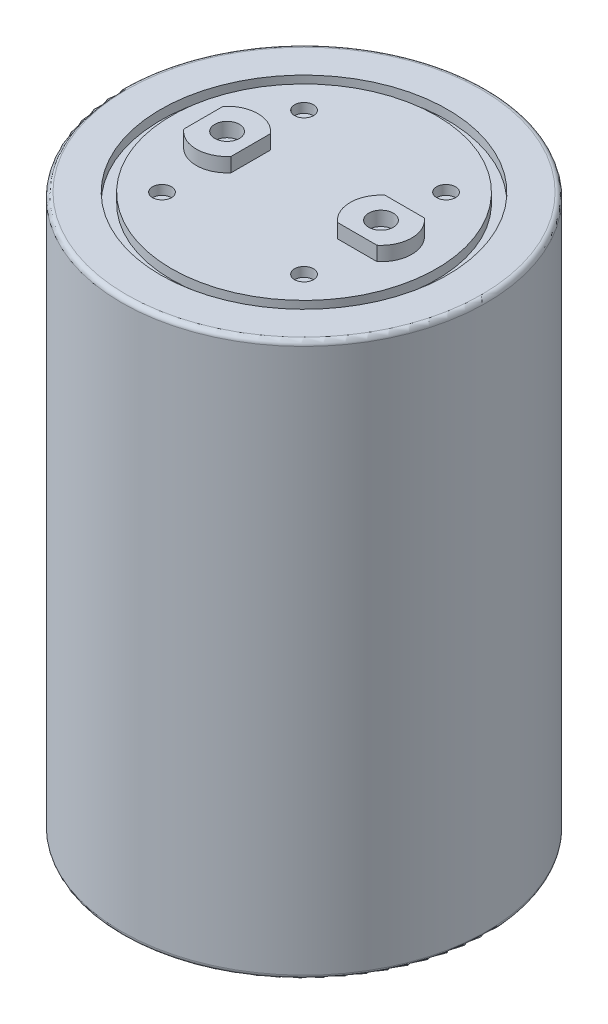
ISO-10303-21;
HEADER;
FILE_DESCRIPTION(('STEP AP214'),'2;1');
FILE_NAME('part.step','',(''),(''),'','','');
FILE_SCHEMA(('AUTOMOTIVE_DESIGN { 1 0 10303 214 1 1 1 1 }'));
ENDSEC;
DATA;
#1=APPLICATION_CONTEXT('core data for automotive mechanical design processes');
#2=APPLICATION_PROTOCOL_DEFINITION('international standard','automotive_design',2000,#1);
#3=PRODUCT_CONTEXT('',#1,'mechanical');
#4=PRODUCT('Part','Part','',(#3));
#5=PRODUCT_RELATED_PRODUCT_CATEGORY('part','',(#4));
#6=PRODUCT_DEFINITION_FORMATION('','',#4);
#7=PRODUCT_DEFINITION_CONTEXT('part definition',#1,'design');
#8=PRODUCT_DEFINITION('design','',#6,#7);
#9=PRODUCT_DEFINITION_SHAPE('','',#8);
#10=(LENGTH_UNIT() NAMED_UNIT(*) SI_UNIT(.MILLI.,.METRE.));
#11=(NAMED_UNIT(*) PLANE_ANGLE_UNIT() SI_UNIT($,.RADIAN.));
#12=(NAMED_UNIT(*) SI_UNIT($,.STERADIAN.) SOLID_ANGLE_UNIT());
#13=UNCERTAINTY_MEASURE_WITH_UNIT(LENGTH_MEASURE(1.E-05),#10,'distance_accuracy_value','');
#14=(GEOMETRIC_REPRESENTATION_CONTEXT(3) GLOBAL_UNCERTAINTY_ASSIGNED_CONTEXT((#13)) GLOBAL_UNIT_ASSIGNED_CONTEXT((#10,
#11,#12)) REPRESENTATION_CONTEXT('',''));
#15=CARTESIAN_POINT('',(0.,0.,0.));
#16=DIRECTION('',(0.,0.,1.));
#17=DIRECTION('',(1.,0.,0.));
#18=AXIS2_PLACEMENT_3D('',#15,#16,#17);
#19=CARTESIAN_POINT('',(1.1478244810946,60.4471649497469,37.8154701534106));
#20=DIRECTION('',(0.,1.,0.));
#21=DIRECTION('',(0.,0.,1.));
#22=AXIS2_PLACEMENT_3D('',#19,#20,#21);
#23=PLANE('',#22);
#24=CARTESIAN_POINT('',(16.1478244810946,60.4471649497469,22.8154701534106));
#25=DIRECTION('',(0.,1.,0.));
#26=DIRECTION('',(0.,0.,1.));
#27=AXIS2_PLACEMENT_3D('',#24,#25,#26);
#28=CIRCLE('',#27,2.);
#29=CARTESIAN_POINT('',(16.1478244810946,60.4471649497469,24.8154701534106));
#30=VERTEX_POINT('',#29);
#31=EDGE_CURVE('E69',#30,#30,#28,.T.);
#32=ORIENTED_EDGE('',*,*,#31,.F.);
#33=EDGE_LOOP('',(#32));
#34=FACE_BOUND('',#33,.T.);
#35=CARTESIAN_POINT('',(-13.8521755189054,60.4471649497469,22.8154701534106));
#36=DIRECTION('',(0.,1.,0.));
#37=DIRECTION('',(0.,0.,-1.));
#38=AXIS2_PLACEMENT_3D('',#35,#36,#37);
#39=CIRCLE('',#38,2.);
#40=CARTESIAN_POINT('',(-13.8521755189054,60.4471649497469,20.8154701534106));
#41=VERTEX_POINT('',#40);
#42=EDGE_CURVE('E58',#41,#41,#39,.T.);
#43=ORIENTED_EDGE('',*,*,#42,.F.);
#44=EDGE_LOOP('',(#43));
#45=FACE_BOUND('',#44,.T.);
#46=CARTESIAN_POINT('',(1.1478244810946,60.4471649497469,37.8154701534106));
#47=DIRECTION('',(0.,1.,0.));
#48=DIRECTION('',(0.,0.,1.));
#49=AXIS2_PLACEMENT_3D('',#46,#47,#48);
#50=CIRCLE('',#49,28.);
#51=CARTESIAN_POINT('',(1.1478244810946,60.4471649497469,65.8154701534106));
#52=VERTEX_POINT('',#51);
#53=EDGE_CURVE('E11',#52,#52,#50,.T.);
#54=ORIENTED_EDGE('',*,*,#53,.T.);
#55=EDGE_LOOP('',(#54));
#56=FACE_BOUND('',#55,.T.);
#57=CARTESIAN_POINT('',(16.1478244810946,60.4471649497469,52.8154701534106));
#58=DIRECTION('',(0.,1.,0.));
#59=DIRECTION('',(0.,0.,1.));
#60=AXIS2_PLACEMENT_3D('',#57,#58,#59);
#61=CIRCLE('',#60,2.);
#62=CARTESIAN_POINT('',(16.1478244810946,60.4471649497469,54.8154701534106));
#63=VERTEX_POINT('',#62);
#64=EDGE_CURVE('E63',#63,#63,#61,.T.);
#65=ORIENTED_EDGE('',*,*,#64,.F.);
#66=EDGE_LOOP('',(#65));
#67=FACE_BOUND('',#66,.T.);
#68=CARTESIAN_POINT('',(-13.8521755189054,60.4471649497469,52.8154701534106));
#69=DIRECTION('',(0.,1.,0.));
#70=DIRECTION('',(0.,0.,-1.));
#71=AXIS2_PLACEMENT_3D('',#68,#69,#70);
#72=CIRCLE('',#71,2.);
#73=CARTESIAN_POINT('',(-13.8521755189054,60.4471649497469,50.8154701534106));
#74=VERTEX_POINT('',#73);
#75=EDGE_CURVE('E75',#74,#74,#72,.T.);
#76=ORIENTED_EDGE('',*,*,#75,.F.);
#77=EDGE_LOOP('',(#76));
#78=FACE_BOUND('',#77,.T.);
#79=ADVANCED_FACE('F47',(#34,#45,#56,#67,#78),#23,.T.);
#80=CARTESIAN_POINT('',(1.1478244810946,58.4471649497469,37.8154701534106));
#81=DIRECTION('',(0.,1.,0.));
#82=DIRECTION('',(0.,0.,1.));
#83=AXIS2_PLACEMENT_3D('',#80,#81,#82);
#84=PLANE('',#83);
#85=CARTESIAN_POINT('',(1.1478244810946,58.4471649497469,37.8154701534106));
#86=DIRECTION('',(0.,1.,0.));
#87=DIRECTION('',(0.,0.,1.));
#88=AXIS2_PLACEMENT_3D('',#85,#86,#87);
#89=CIRCLE('',#88,28.);
#90=CARTESIAN_POINT('',(1.1478244810946,58.4471649497469,65.8154701534106));
#91=VERTEX_POINT('',#90);
#92=EDGE_CURVE('E51',#91,#91,#89,.T.);
#93=ORIENTED_EDGE('',*,*,#92,.F.);
#94=EDGE_LOOP('',(#93));
#95=FACE_BOUND('',#94,.T.);
#96=CARTESIAN_POINT('',(-13.8521755189054,58.4471649497469,22.8154701534106));
#97=DIRECTION('',(0.,1.,0.));
#98=DIRECTION('',(0.,0.,-1.));
#99=AXIS2_PLACEMENT_3D('',#96,#97,#98);
#100=CIRCLE('',#99,2.);
#101=CARTESIAN_POINT('',(-13.8521755189054,58.4471649497469,20.8154701534106));
#102=VERTEX_POINT('',#101);
#103=EDGE_CURVE('E60',#102,#102,#100,.T.);
#104=ORIENTED_EDGE('',*,*,#103,.T.);
#105=EDGE_LOOP('',(#104));
#106=FACE_BOUND('',#105,.T.);
#107=CARTESIAN_POINT('',(16.1478244810946,58.4471649497469,52.8154701534106));
#108=DIRECTION('',(0.,1.,0.));
#109=DIRECTION('',(0.,0.,1.));
#110=AXIS2_PLACEMENT_3D('',#107,#108,#109);
#111=CIRCLE('',#110,2.);
#112=CARTESIAN_POINT('',(16.1478244810946,58.4471649497469,54.8154701534106));
#113=VERTEX_POINT('',#112);
#114=EDGE_CURVE('E66',#113,#113,#111,.T.);
#115=ORIENTED_EDGE('',*,*,#114,.T.);
#116=EDGE_LOOP('',(#115));
#117=FACE_BOUND('',#116,.T.);
#118=CARTESIAN_POINT('',(16.1478244810946,58.4471649497469,22.8154701534106));
#119=DIRECTION('',(0.,1.,0.));
#120=DIRECTION('',(0.,0.,1.));
#121=AXIS2_PLACEMENT_3D('',#118,#119,#120);
#122=CIRCLE('',#121,2.);
#123=CARTESIAN_POINT('',(16.1478244810946,58.4471649497469,24.8154701534106));
#124=VERTEX_POINT('',#123);
#125=EDGE_CURVE('E72',#124,#124,#122,.T.);
#126=ORIENTED_EDGE('',*,*,#125,.T.);
#127=EDGE_LOOP('',(#126));
#128=FACE_BOUND('',#127,.T.);
#129=CARTESIAN_POINT('',(-13.8521755189054,58.4471649497469,52.8154701534106));
#130=DIRECTION('',(0.,1.,0.));
#131=DIRECTION('',(0.,0.,-1.));
#132=AXIS2_PLACEMENT_3D('',#129,#130,#131);
#133=CIRCLE('',#132,2.);
#134=CARTESIAN_POINT('',(-13.8521755189054,58.4471649497469,50.8154701534106));
#135=VERTEX_POINT('',#134);
#136=EDGE_CURVE('E78',#135,#135,#133,.T.);
#137=ORIENTED_EDGE('',*,*,#136,.T.);
#138=EDGE_LOOP('',(#137));
#139=FACE_BOUND('',#138,.T.);
#140=ADVANCED_FACE('F88',(#95,#106,#117,#128,#139),#84,.F.);
#141=CARTESIAN_POINT('',(1.1478244810946,60.4471649497469,37.8154701534106));
#142=DIRECTION('',(0.,-1.,0.));
#143=DIRECTION('',(0.,0.,-1.));
#144=AXIS2_PLACEMENT_3D('',#141,#142,#143);
#145=CYLINDRICAL_SURFACE('',#144,28.);
#146=ORIENTED_EDGE('',*,*,#53,.F.);
#147=EDGE_LOOP('',(#146));
#148=FACE_BOUND('',#147,.T.);
#149=ORIENTED_EDGE('',*,*,#92,.T.);
#150=EDGE_LOOP('',(#149));
#151=FACE_BOUND('',#150,.T.);
#152=ADVANCED_FACE('F49',(#148,#151),#145,.T.);
#153=CARTESIAN_POINT('',(-13.8521755189054,60.4471649497469,22.8154701534106));
#154=DIRECTION('',(0.,-1.,0.));
#155=DIRECTION('',(0.,0.,-1.));
#156=AXIS2_PLACEMENT_3D('',#153,#154,#155);
#157=CYLINDRICAL_SURFACE('',#156,2.);
#158=ORIENTED_EDGE('',*,*,#42,.T.);
#159=EDGE_LOOP('',(#158));
#160=FACE_BOUND('',#159,.T.);
#161=ORIENTED_EDGE('',*,*,#103,.F.);
#162=EDGE_LOOP('',(#161));
#163=FACE_BOUND('',#162,.T.);
#164=ADVANCED_FACE('F98',(#160,#163),#157,.F.);
#165=CARTESIAN_POINT('',(16.1478244810946,60.4471649497469,52.8154701534106));
#166=DIRECTION('',(0.,-1.,0.));
#167=DIRECTION('',(0.,0.,-1.));
#168=AXIS2_PLACEMENT_3D('',#165,#166,#167);
#169=CYLINDRICAL_SURFACE('',#168,2.);
#170=ORIENTED_EDGE('',*,*,#64,.T.);
#171=EDGE_LOOP('',(#170));
#172=FACE_BOUND('',#171,.T.);
#173=ORIENTED_EDGE('',*,*,#114,.F.);
#174=EDGE_LOOP('',(#173));
#175=FACE_BOUND('',#174,.T.);
#176=ADVANCED_FACE('F101',(#172,#175),#169,.F.);
#177=CARTESIAN_POINT('',(16.1478244810946,60.4471649497469,22.8154701534106));
#178=DIRECTION('',(0.,-1.,0.));
#179=DIRECTION('',(0.,0.,-1.));
#180=AXIS2_PLACEMENT_3D('',#177,#178,#179);
#181=CYLINDRICAL_SURFACE('',#180,2.);
#182=ORIENTED_EDGE('',*,*,#31,.T.);
#183=EDGE_LOOP('',(#182));
#184=FACE_BOUND('',#183,.T.);
#185=ORIENTED_EDGE('',*,*,#125,.F.);
#186=EDGE_LOOP('',(#185));
#187=FACE_BOUND('',#186,.T.);
#188=ADVANCED_FACE('F105',(#184,#187),#181,.F.);
#189=CARTESIAN_POINT('',(-13.8521755189054,60.4471649497469,52.8154701534106));
#190=DIRECTION('',(0.,-1.,0.));
#191=DIRECTION('',(0.,0.,-1.));
#192=AXIS2_PLACEMENT_3D('',#189,#190,#191);
#193=CYLINDRICAL_SURFACE('',#192,2.);
#194=ORIENTED_EDGE('',*,*,#75,.T.);
#195=EDGE_LOOP('',(#194));
#196=FACE_BOUND('',#195,.T.);
#197=ORIENTED_EDGE('',*,*,#136,.F.);
#198=EDGE_LOOP('',(#197));
#199=FACE_BOUND('',#198,.T.);
#200=ADVANCED_FACE('F84',(#196,#199),#193,.F.);
#201=CLOSED_SHELL('',(#79,#140,#152,#164,#176,#188,#200));
#202=MANIFOLD_SOLID_BREP('B2',#201);
#203=CARTESIAN_POINT('',(1.1478244810946,58.4471649497469,37.8154701534106));
#204=DIRECTION('',(0.,1.,0.));
#205=DIRECTION('',(0.,0.,1.));
#206=AXIS2_PLACEMENT_3D('',#203,#204,#205);
#207=PLANE('',#206);
#208=DIRECTION('',(0.,0.,1.));
#209=VECTOR('',#208,1.);
#210=CARTESIAN_POINT('',(-20.1021755189054,58.4471649497469,33.6621582219516));
#211=LINE('',#210,#209);
#212=CARTESIAN_POINT('',(-20.1021755189054,58.4471649497469,33.6621582219516));
#213=VERTEX_POINT('',#212);
#214=CARTESIAN_POINT('',(-20.1021755189054,58.4471649497469,41.9687820848696));
#215=VERTEX_POINT('',#214);
#216=EDGE_CURVE('E285',#213,#215,#211,.T.);
#217=ORIENTED_EDGE('',*,*,#216,.F.);
#218=CARTESIAN_POINT('',(-15.1021755189054,58.4471649497469,37.8154701534106));
#219=DIRECTION('',(0.,1.,0.));
#220=DIRECTION('',(0.,0.,1.));
#221=AXIS2_PLACEMENT_3D('',#218,#219,#220);
#222=CIRCLE('',#221,6.5);
#223=CARTESIAN_POINT('',(-10.1021755189054,58.4471649497469,33.6621582219516));
#224=VERTEX_POINT('',#223);
#225=EDGE_CURVE('E267',#224,#213,#222,.T.);
#226=ORIENTED_EDGE('',*,*,#225,.F.);
#227=DIRECTION('',(0.,0.,-1.));
#228=VECTOR('',#227,1.);
#229=CARTESIAN_POINT('',(-10.1021755189054,58.4471649497469,41.9687820848696));
#230=LINE('',#229,#228);
#231=CARTESIAN_POINT('',(-10.1021755189054,58.4471649497469,41.9687820848696));
#232=VERTEX_POINT('',#231);
#233=EDGE_CURVE('E276',#232,#224,#230,.T.);
#234=ORIENTED_EDGE('',*,*,#233,.F.);
#235=CARTESIAN_POINT('',(-15.1021755189054,58.4471649497469,37.8154701534106));
#236=DIRECTION('',(0.,1.,0.));
#237=DIRECTION('',(0.,0.,-1.));
#238=AXIS2_PLACEMENT_3D('',#235,#236,#237);
#239=CIRCLE('',#238,6.5);
#240=EDGE_CURVE('E287',#215,#232,#239,.T.);
#241=ORIENTED_EDGE('',*,*,#240,.F.);
#242=EDGE_LOOP('',(#217,#226,#234,#241));
#243=FACE_BOUND('',#242,.T.);
#244=DIRECTION('',(-1.,0.,0.));
#245=VECTOR('',#244,1.);
#246=CARTESIAN_POINT('',(13.2445125496356,58.4471649497469,32.8154701534106));
#247=LINE('',#246,#245);
#248=CARTESIAN_POINT('',(21.5511364125536,58.4471649497469,32.8154701534106));
#249=VERTEX_POINT('',#248);
#250=CARTESIAN_POINT('',(13.2445125496356,58.4471649497469,32.8154701534106));
#251=VERTEX_POINT('',#250);
#252=EDGE_CURVE('E552',#249,#251,#247,.T.);
#253=ORIENTED_EDGE('',*,*,#252,.F.);
#254=CARTESIAN_POINT('',(17.3978244810946,58.4471649497469,37.8154701534106));
#255=DIRECTION('',(0.,1.,0.));
#256=DIRECTION('',(0.,0.,-1.));
#257=AXIS2_PLACEMENT_3D('',#254,#255,#256);
#258=CIRCLE('',#257,6.5);
#259=CARTESIAN_POINT('',(21.5511364125536,58.4471649497469,42.8154701534106));
#260=VERTEX_POINT('',#259);
#261=EDGE_CURVE('E262',#260,#249,#258,.T.);
#262=ORIENTED_EDGE('',*,*,#261,.F.);
#263=DIRECTION('',(1.,0.,0.));
#264=VECTOR('',#263,1.);
#265=CARTESIAN_POINT('',(21.5511364125536,58.4471649497469,42.8154701534106));
#266=LINE('',#265,#264);
#267=CARTESIAN_POINT('',(13.2445125496356,58.4471649497469,42.8154701534106));
#268=VERTEX_POINT('',#267);
#269=EDGE_CURVE('E258',#268,#260,#266,.T.);
#270=ORIENTED_EDGE('',*,*,#269,.F.);
#271=CARTESIAN_POINT('',(17.3978244810946,58.4471649497469,37.8154701534106));
#272=DIRECTION('',(0.,1.,0.));
#273=DIRECTION('',(0.,0.,1.));
#274=AXIS2_PLACEMENT_3D('',#271,#272,#273);
#275=CIRCLE('',#274,6.50000000000001);
#276=EDGE_CURVE('E554',#251,#268,#275,.T.);
#277=ORIENTED_EDGE('',*,*,#276,.F.);
#278=EDGE_LOOP('',(#253,#262,#270,#277));
#279=FACE_BOUND('',#278,.T.);
#280=CARTESIAN_POINT('',(1.1478244810946,58.4471649497469,37.8154701534106));
#281=DIRECTION('',(0.,1.,0.));
#282=DIRECTION('',(0.,0.,1.));
#283=AXIS2_PLACEMENT_3D('',#280,#281,#282);
#284=CIRCLE('',#283,30.3);
#285=CARTESIAN_POINT('',(1.1478244810946,58.4471649497469,68.1154701534106));
#286=VERTEX_POINT('',#285);
#287=EDGE_CURVE('E304',#286,#286,#284,.F.);
#288=ORIENTED_EDGE('',*,*,#287,.F.);
#289=EDGE_LOOP('',(#288));
#290=FACE_BOUND('',#289,.T.);
#291=ADVANCED_FACE('F172',(#243,#279,#290),#207,.T.);
#292=CARTESIAN_POINT('',(-15.1021755189054,63.4471649497469,37.8154701534106));
#293=DIRECTION('',(0.,1.,0.));
#294=DIRECTION('',(0.,0.,1.));
#295=AXIS2_PLACEMENT_3D('',#292,#293,#294);
#296=PLANE('',#295);
#297=CARTESIAN_POINT('',(-15.1021755189054,63.4471649497469,37.8154701534106));
#298=DIRECTION('',(0.,1.,0.));
#299=DIRECTION('',(0.,0.,1.));
#300=AXIS2_PLACEMENT_3D('',#297,#298,#299);
#301=CIRCLE('',#300,6.5);
#302=CARTESIAN_POINT('',(-10.1021755189054,63.4471649497469,33.6621582219516));
#303=VERTEX_POINT('',#302);
#304=CARTESIAN_POINT('',(-20.1021755189054,63.4471649497469,33.6621582219516));
#305=VERTEX_POINT('',#304);
#306=EDGE_CURVE('E272',#303,#305,#301,.T.);
#307=ORIENTED_EDGE('',*,*,#306,.T.);
#308=DIRECTION('',(0.,0.,1.));
#309=VECTOR('',#308,1.);
#310=CARTESIAN_POINT('',(-20.1021755189054,63.4471649497469,33.6621582219516));
#311=LINE('',#310,#309);
#312=CARTESIAN_POINT('',(-20.1021755189054,63.4471649497469,41.9687820848696));
#313=VERTEX_POINT('',#312);
#314=EDGE_CURVE('E275',#305,#313,#311,.T.);
#315=ORIENTED_EDGE('',*,*,#314,.T.);
#316=CARTESIAN_POINT('',(-15.1021755189054,63.4471649497469,37.8154701534106));
#317=DIRECTION('',(0.,1.,0.));
#318=DIRECTION('',(0.,0.,-1.));
#319=AXIS2_PLACEMENT_3D('',#316,#317,#318);
#320=CIRCLE('',#319,6.5);
#321=CARTESIAN_POINT('',(-10.1021755189054,63.4471649497469,41.9687820848696));
#322=VERTEX_POINT('',#321);
#323=EDGE_CURVE('E278',#313,#322,#320,.T.);
#324=ORIENTED_EDGE('',*,*,#323,.T.);
#325=DIRECTION('',(0.,0.,-1.));
#326=VECTOR('',#325,1.);
#327=CARTESIAN_POINT('',(-10.1021755189054,63.4471649497469,41.9687820848696));
#328=LINE('',#327,#326);
#329=EDGE_CURVE('E280',#322,#303,#328,.T.);
#330=ORIENTED_EDGE('',*,*,#329,.T.);
#331=EDGE_LOOP('',(#307,#315,#324,#330));
#332=FACE_BOUND('',#331,.T.);
#333=CARTESIAN_POINT('',(-15.1021755189054,63.4471649497469,37.8154701534106));
#334=DIRECTION('',(0.,1.,0.));
#335=DIRECTION('',(0.,0.,1.));
#336=AXIS2_PLACEMENT_3D('',#333,#334,#335);
#337=CIRCLE('',#336,2.6);
#338=CARTESIAN_POINT('',(-15.1021755189054,63.4471649497469,40.4154701534106));
#339=VERTEX_POINT('',#338);
#340=EDGE_CURVE('E264',#339,#339,#337,.T.);
#341=ORIENTED_EDGE('',*,*,#340,.F.);
#342=EDGE_LOOP('',(#341));
#343=FACE_BOUND('',#342,.T.);
#344=ADVANCED_FACE('F336',(#332,#343),#296,.T.);
#345=CARTESIAN_POINT('',(-15.1021755189054,63.4471649497469,37.8154701534106));
#346=DIRECTION('',(0.,-1.,0.));
#347=DIRECTION('',(0.,0.,-1.));
#348=AXIS2_PLACEMENT_3D('',#345,#346,#347);
#349=CYLINDRICAL_SURFACE('',#348,6.5);
#350=ORIENTED_EDGE('',*,*,#225,.T.);
#351=DIRECTION('',(0.,-1.,0.));
#352=VECTOR('',#351,1.);
#353=CARTESIAN_POINT('',(-20.1021755189054,63.4471649497469,33.6621582219516));
#354=LINE('',#353,#352);
#355=EDGE_CURVE('E296',#305,#213,#354,.T.);
#356=ORIENTED_EDGE('',*,*,#355,.F.);
#357=ORIENTED_EDGE('',*,*,#306,.F.);
#358=DIRECTION('',(0.,-1.,0.));
#359=VECTOR('',#358,1.);
#360=CARTESIAN_POINT('',(-10.1021755189054,63.4471649497469,33.6621582219516));
#361=LINE('',#360,#359);
#362=EDGE_CURVE('E282',#303,#224,#361,.T.);
#363=ORIENTED_EDGE('',*,*,#362,.T.);
#364=EDGE_LOOP('',(#350,#356,#357,#363));
#365=FACE_BOUND('',#364,.T.);
#366=ADVANCED_FACE('F344',(#365),#349,.T.);
#367=CARTESIAN_POINT('',(-20.1021755189054,63.4471649497469,33.6621582219516));
#368=DIRECTION('',(1.,0.,0.));
#369=DIRECTION('',(0.,0.,-1.));
#370=AXIS2_PLACEMENT_3D('',#367,#368,#369);
#371=PLANE('',#370);
#372=ORIENTED_EDGE('',*,*,#216,.T.);
#373=DIRECTION('',(0.,-1.,0.));
#374=VECTOR('',#373,1.);
#375=CARTESIAN_POINT('',(-20.1021755189054,63.4471649497469,41.9687820848696));
#376=LINE('',#375,#374);
#377=EDGE_CURVE('E293',#313,#215,#376,.T.);
#378=ORIENTED_EDGE('',*,*,#377,.F.);
#379=ORIENTED_EDGE('',*,*,#314,.F.);
#380=ORIENTED_EDGE('',*,*,#355,.T.);
#381=EDGE_LOOP('',(#372,#378,#379,#380));
#382=FACE_BOUND('',#381,.T.);
#383=ADVANCED_FACE('F377',(#382),#371,.F.);
#384=CARTESIAN_POINT('',(-15.1021755189054,63.4471649497469,37.8154701534106));
#385=DIRECTION('',(0.,-1.,0.));
#386=DIRECTION('',(0.,0.,-1.));
#387=AXIS2_PLACEMENT_3D('',#384,#385,#386);
#388=CYLINDRICAL_SURFACE('',#387,6.5);
#389=ORIENTED_EDGE('',*,*,#240,.T.);
#390=DIRECTION('',(0.,-1.,0.));
#391=VECTOR('',#390,1.);
#392=CARTESIAN_POINT('',(-10.1021755189054,63.4471649497469,41.9687820848696));
#393=LINE('',#392,#391);
#394=EDGE_CURVE('E195',#322,#232,#393,.T.);
#395=ORIENTED_EDGE('',*,*,#394,.F.);
#396=ORIENTED_EDGE('',*,*,#323,.F.);
#397=ORIENTED_EDGE('',*,*,#377,.T.);
#398=EDGE_LOOP('',(#389,#395,#396,#397));
#399=FACE_BOUND('',#398,.T.);
#400=ADVANCED_FACE('F370',(#399),#388,.T.);
#401=CARTESIAN_POINT('',(-10.1021755189054,63.4471649497469,41.9687820848696));
#402=DIRECTION('',(-1.,0.,0.));
#403=DIRECTION('',(0.,0.,1.));
#404=AXIS2_PLACEMENT_3D('',#401,#402,#403);
#405=PLANE('',#404);
#406=ORIENTED_EDGE('',*,*,#233,.T.);
#407=ORIENTED_EDGE('',*,*,#362,.F.);
#408=ORIENTED_EDGE('',*,*,#329,.F.);
#409=ORIENTED_EDGE('',*,*,#394,.T.);
#410=EDGE_LOOP('',(#406,#407,#408,#409));
#411=FACE_BOUND('',#410,.T.);
#412=ADVANCED_FACE('F362',(#411),#405,.F.);
#413=CARTESIAN_POINT('',(-15.1021755189054,63.4471649497469,37.8154701534106));
#414=DIRECTION('',(0.,-1.,0.));
#415=DIRECTION('',(0.,0.,-1.));
#416=AXIS2_PLACEMENT_3D('',#413,#414,#415);
#417=CYLINDRICAL_SURFACE('',#416,2.6);
#418=ORIENTED_EDGE('',*,*,#340,.T.);
#419=EDGE_LOOP('',(#418));
#420=FACE_BOUND('',#419,.T.);
#421=CARTESIAN_POINT('',(-15.1021755189054,58.4471649497469,37.8154701534106));
#422=DIRECTION('',(0.,1.,0.));
#423=DIRECTION('',(0.,0.,1.));
#424=AXIS2_PLACEMENT_3D('',#421,#422,#423);
#425=CIRCLE('',#424,2.6);
#426=CARTESIAN_POINT('',(-15.1021755189054,58.4471649497469,40.4154701534106));
#427=VERTEX_POINT('',#426);
#428=EDGE_CURVE('E298',#427,#427,#425,.F.);
#429=ORIENTED_EDGE('',*,*,#428,.T.);
#430=EDGE_LOOP('',(#429));
#431=FACE_BOUND('',#430,.T.);
#432=ADVANCED_FACE('F355',(#420,#431),#417,.F.);
#433=ORIENTED_EDGE('',*,*,#428,.F.);
#434=EDGE_LOOP('',(#433));
#435=FACE_BOUND('',#434,.T.);
#436=ADVANCED_FACE('F340',(#435),#207,.T.);
#437=CARTESIAN_POINT('',(17.3978244810946,63.4471649497469,37.8154701534106));
#438=DIRECTION('',(0.,-1.,0.));
#439=DIRECTION('',(0.,0.,-1.));
#440=AXIS2_PLACEMENT_3D('',#437,#438,#439);
#441=PLANE('',#440);
#442=CARTESIAN_POINT('',(17.3978244810946,63.4471649497469,37.8154701534106));
#443=DIRECTION('',(0.,1.,0.));
#444=DIRECTION('',(0.,0.,-1.));
#445=AXIS2_PLACEMENT_3D('',#442,#443,#444);
#446=CIRCLE('',#445,6.5);
#447=CARTESIAN_POINT('',(21.5511364125536,63.4471649497469,42.8154701534106));
#448=VERTEX_POINT('',#447);
#449=CARTESIAN_POINT('',(21.5511364125536,63.4471649497469,32.8154701534106));
#450=VERTEX_POINT('',#449);
#451=EDGE_CURVE('E249',#448,#450,#446,.T.);
#452=ORIENTED_EDGE('',*,*,#451,.T.);
#453=DIRECTION('',(-1.,0.,0.));
#454=VECTOR('',#453,1.);
#455=CARTESIAN_POINT('',(13.2445125496356,63.4471649497469,32.8154701534106));
#456=LINE('',#455,#454);
#457=CARTESIAN_POINT('',(13.2445125496356,63.4471649497469,32.8154701534106));
#458=VERTEX_POINT('',#457);
#459=EDGE_CURVE('E238',#450,#458,#456,.T.);
#460=ORIENTED_EDGE('',*,*,#459,.T.);
#461=CARTESIAN_POINT('',(17.3978244810946,63.4471649497469,37.8154701534106));
#462=DIRECTION('',(0.,1.,0.));
#463=DIRECTION('',(0.,0.,1.));
#464=AXIS2_PLACEMENT_3D('',#461,#462,#463);
#465=CIRCLE('',#464,6.50000000000001);
#466=CARTESIAN_POINT('',(13.2445125496356,63.4471649497469,42.8154701534106));
#467=VERTEX_POINT('',#466);
#468=EDGE_CURVE('E248',#458,#467,#465,.T.);
#469=ORIENTED_EDGE('',*,*,#468,.T.);
#470=DIRECTION('',(1.,0.,0.));
#471=VECTOR('',#470,1.);
#472=CARTESIAN_POINT('',(21.5511364125536,63.4471649497469,42.8154701534106));
#473=LINE('',#472,#471);
#474=EDGE_CURVE('E254',#467,#448,#473,.T.);
#475=ORIENTED_EDGE('',*,*,#474,.T.);
#476=EDGE_LOOP('',(#452,#460,#469,#475));
#477=FACE_BOUND('',#476,.T.);
#478=CARTESIAN_POINT('',(17.3978244810946,63.4471649497469,37.8154701534106));
#479=DIRECTION('',(0.,1.,0.));
#480=DIRECTION('',(0.,0.,1.));
#481=AXIS2_PLACEMENT_3D('',#478,#479,#480);
#482=CIRCLE('',#481,2.6);
#483=CARTESIAN_POINT('',(17.3978244810946,63.4471649497469,40.4154701534106));
#484=VERTEX_POINT('',#483);
#485=EDGE_CURVE('E543',#484,#484,#482,.T.);
#486=ORIENTED_EDGE('',*,*,#485,.F.);
#487=EDGE_LOOP('',(#486));
#488=FACE_BOUND('',#487,.T.);
#489=ADVANCED_FACE('F252',(#477,#488),#441,.F.);
#490=CARTESIAN_POINT('',(17.3978244810946,63.4471649497469,37.8154701534106));
#491=DIRECTION('',(0.,-1.,0.));
#492=DIRECTION('',(0.,0.,-1.));
#493=AXIS2_PLACEMENT_3D('',#490,#491,#492);
#494=CYLINDRICAL_SURFACE('',#493,6.5);
#495=ORIENTED_EDGE('',*,*,#261,.T.);
#496=DIRECTION('',(0.,-1.,0.));
#497=VECTOR('',#496,1.);
#498=CARTESIAN_POINT('',(21.5511364125536,63.4471649497469,32.8154701534106));
#499=LINE('',#498,#497);
#500=EDGE_CURVE('E242',#450,#249,#499,.T.);
#501=ORIENTED_EDGE('',*,*,#500,.F.);
#502=ORIENTED_EDGE('',*,*,#451,.F.);
#503=DIRECTION('',(0.,-1.,0.));
#504=VECTOR('',#503,1.);
#505=CARTESIAN_POINT('',(21.5511364125536,63.4471649497469,42.8154701534106));
#506=LINE('',#505,#504);
#507=EDGE_CURVE('E550',#448,#260,#506,.T.);
#508=ORIENTED_EDGE('',*,*,#507,.T.);
#509=EDGE_LOOP('',(#495,#501,#502,#508));
#510=FACE_BOUND('',#509,.T.);
#511=ADVANCED_FACE('F260',(#510),#494,.T.);
#512=CARTESIAN_POINT('',(13.2445125496356,63.4471649497469,32.8154701534106));
#513=DIRECTION('',(0.,0.,1.));
#514=DIRECTION('',(1.,0.,0.));
#515=AXIS2_PLACEMENT_3D('',#512,#513,#514);
#516=PLANE('',#515);
#517=ORIENTED_EDGE('',*,*,#252,.T.);
#518=DIRECTION('',(0.,-1.,0.));
#519=VECTOR('',#518,1.);
#520=CARTESIAN_POINT('',(13.2445125496356,63.4471649497469,32.8154701534106));
#521=LINE('',#520,#519);
#522=EDGE_CURVE('E245',#458,#251,#521,.T.);
#523=ORIENTED_EDGE('',*,*,#522,.F.);
#524=ORIENTED_EDGE('',*,*,#459,.F.);
#525=ORIENTED_EDGE('',*,*,#500,.T.);
#526=EDGE_LOOP('',(#517,#523,#524,#525));
#527=FACE_BOUND('',#526,.T.);
#528=ADVANCED_FACE('F240',(#527),#516,.F.);
#529=CARTESIAN_POINT('',(17.3978244810946,63.4471649497469,37.8154701534106));
#530=DIRECTION('',(0.,-1.,0.));
#531=DIRECTION('',(0.,0.,-1.));
#532=AXIS2_PLACEMENT_3D('',#529,#530,#531);
#533=CYLINDRICAL_SURFACE('',#532,6.50000000000001);
#534=ORIENTED_EDGE('',*,*,#276,.T.);
#535=DIRECTION('',(0.,-1.,0.));
#536=VECTOR('',#535,1.);
#537=CARTESIAN_POINT('',(13.2445125496356,63.4471649497469,42.8154701534106));
#538=LINE('',#537,#536);
#539=EDGE_CURVE('E187',#467,#268,#538,.T.);
#540=ORIENTED_EDGE('',*,*,#539,.F.);
#541=ORIENTED_EDGE('',*,*,#468,.F.);
#542=ORIENTED_EDGE('',*,*,#522,.T.);
#543=EDGE_LOOP('',(#534,#540,#541,#542));
#544=FACE_BOUND('',#543,.T.);
#545=ADVANCED_FACE('F439',(#544),#533,.T.);
#546=CARTESIAN_POINT('',(21.5511364125536,63.4471649497469,42.8154701534106));
#547=DIRECTION('',(0.,0.,-1.));
#548=DIRECTION('',(-1.,0.,0.));
#549=AXIS2_PLACEMENT_3D('',#546,#547,#548);
#550=PLANE('',#549);
#551=ORIENTED_EDGE('',*,*,#269,.T.);
#552=ORIENTED_EDGE('',*,*,#507,.F.);
#553=ORIENTED_EDGE('',*,*,#474,.F.);
#554=ORIENTED_EDGE('',*,*,#539,.T.);
#555=EDGE_LOOP('',(#551,#552,#553,#554));
#556=FACE_BOUND('',#555,.T.);
#557=ADVANCED_FACE('F447',(#556),#550,.F.);
#558=CARTESIAN_POINT('',(17.3978244810946,63.4471649497469,37.8154701534106));
#559=DIRECTION('',(0.,-1.,0.));
#560=DIRECTION('',(0.,0.,-1.));
#561=AXIS2_PLACEMENT_3D('',#558,#559,#560);
#562=CYLINDRICAL_SURFACE('',#561,2.6);
#563=ORIENTED_EDGE('',*,*,#485,.T.);
#564=EDGE_LOOP('',(#563));
#565=FACE_BOUND('',#564,.T.);
#566=CARTESIAN_POINT('',(17.3978244810946,58.4471649497469,37.8154701534106));
#567=DIRECTION('',(0.,1.,0.));
#568=DIRECTION('',(0.,0.,1.));
#569=AXIS2_PLACEMENT_3D('',#566,#567,#568);
#570=CIRCLE('',#569,2.6);
#571=CARTESIAN_POINT('',(17.3978244810946,58.4471649497469,40.4154701534106));
#572=VERTEX_POINT('',#571);
#573=EDGE_CURVE('E301',#572,#572,#570,.F.);
#574=ORIENTED_EDGE('',*,*,#573,.T.);
#575=EDGE_LOOP('',(#574));
#576=FACE_BOUND('',#575,.T.);
#577=ADVANCED_FACE('F352',(#565,#576),#562,.F.);
#578=ORIENTED_EDGE('',*,*,#573,.F.);
#579=EDGE_LOOP('',(#578));
#580=FACE_BOUND('',#579,.T.);
#581=ADVANCED_FACE('F339',(#580),#207,.T.);
#582=CARTESIAN_POINT('',(1.1478244810946,60.4471649497469,37.8154701534106));
#583=DIRECTION('',(0.,1.,0.));
#584=DIRECTION('',(0.,0.,1.));
#585=AXIS2_PLACEMENT_3D('',#582,#583,#584);
#586=PLANE('',#585);
#587=CARTESIAN_POINT('',(1.1478244810946,60.4471649497469,37.8154701534106));
#588=DIRECTION('',(0.,1.,0.));
#589=DIRECTION('',(0.,0.,1.));
#590=AXIS2_PLACEMENT_3D('',#587,#588,#589);
#591=CIRCLE('',#590,37.5);
#592=CARTESIAN_POINT('',(1.1478244810946,60.4471649497469,75.3154701534106));
#593=VERTEX_POINT('',#592);
#594=EDGE_CURVE('E180',#593,#593,#591,.T.);
#595=ORIENTED_EDGE('',*,*,#594,.T.);
#596=EDGE_LOOP('',(#595));
#597=FACE_BOUND('',#596,.T.);
#598=CARTESIAN_POINT('',(1.1478244810946,60.4471649497469,37.8154701534106));
#599=DIRECTION('',(0.,1.,0.));
#600=DIRECTION('',(0.,0.,1.));
#601=AXIS2_PLACEMENT_3D('',#598,#599,#600);
#602=CIRCLE('',#601,30.3);
#603=CARTESIAN_POINT('',(1.1478244810946,60.4471649497469,68.1154701534106));
#604=VERTEX_POINT('',#603);
#605=EDGE_CURVE('E540',#604,#604,#602,.T.);
#606=ORIENTED_EDGE('',*,*,#605,.F.);
#607=EDGE_LOOP('',(#606));
#608=FACE_BOUND('',#607,.T.);
#609=ADVANCED_FACE('F318',(#597,#608),#586,.T.);
#610=CARTESIAN_POINT('',(1.1478244810946,60.4471649497469,37.8154701534106));
#611=DIRECTION('',(0.,-1.,0.));
#612=DIRECTION('',(0.,0.,-1.));
#613=AXIS2_PLACEMENT_3D('',#610,#611,#612);
#614=CYLINDRICAL_SURFACE('',#613,30.3);
#615=ORIENTED_EDGE('',*,*,#605,.T.);
#616=EDGE_LOOP('',(#615));
#617=FACE_BOUND('',#616,.T.);
#618=ORIENTED_EDGE('',*,*,#287,.T.);
#619=EDGE_LOOP('',(#618));
#620=FACE_BOUND('',#619,.T.);
#621=ADVANCED_FACE('F480',(#617,#620),#614,.F.);
#622=CARTESIAN_POINT('',(1.1478244810946,-56.5528350502531,37.8154701534106));
#623=DIRECTION('',(0.,1.,0.));
#624=DIRECTION('',(0.,0.,1.));
#625=AXIS2_PLACEMENT_3D('',#622,#623,#624);
#626=PLANE('',#625);
#627=CARTESIAN_POINT('',(1.1478244810946,-56.5528350502531,37.8154701534106));
#628=DIRECTION('',(0.,1.,0.));
#629=DIRECTION('',(0.,0.,1.));
#630=AXIS2_PLACEMENT_3D('',#627,#628,#629);
#631=CIRCLE('',#630,6.);
#632=CARTESIAN_POINT('',(1.1478244810946,-56.5528350502531,43.8154701534106));
#633=VERTEX_POINT('',#632);
#634=EDGE_CURVE('E45',#633,#633,#631,.F.);
#635=ORIENTED_EDGE('',*,*,#634,.F.);
#636=EDGE_LOOP('',(#635));
#637=FACE_BOUND('',#636,.T.);
#638=CARTESIAN_POINT('',(1.1478244810946,-56.5528350502531,37.8154701534106));
#639=DIRECTION('',(0.,1.,0.));
#640=DIRECTION('',(0.,0.,1.));
#641=AXIS2_PLACEMENT_3D('',#638,#639,#640);
#642=CIRCLE('',#641,37.5);
#643=CARTESIAN_POINT('',(1.1478244810946,-56.5528350502531,75.3154701534106));
#644=VERTEX_POINT('',#643);
#645=EDGE_CURVE('E313',#644,#644,#642,.F.);
#646=ORIENTED_EDGE('',*,*,#645,.T.);
#647=EDGE_LOOP('',(#646));
#648=FACE_BOUND('',#647,.T.);
#649=ADVANCED_FACE('F489',(#637,#648),#626,.F.);
#650=CARTESIAN_POINT('',(1.1478244810946,58.4471649497469,37.8154701534106));
#651=DIRECTION('',(0.,-1.,0.));
#652=DIRECTION('',(0.,0.,-1.));
#653=AXIS2_PLACEMENT_3D('',#650,#651,#652);
#654=CYLINDRICAL_SURFACE('',#653,38.5);
#655=CARTESIAN_POINT('',(1.1478244810946,-55.5528350502531,37.8154701534106));
#656=DIRECTION('',(0.,1.,0.));
#657=DIRECTION('',(0.,0.,1.));
#658=AXIS2_PLACEMENT_3D('',#655,#656,#657);
#659=CIRCLE('',#658,38.5);
#660=CARTESIAN_POINT('',(1.1478244810946,-55.5528350502531,76.3154701534106));
#661=VERTEX_POINT('',#660);
#662=EDGE_CURVE('E310',#661,#661,#659,.T.);
#663=ORIENTED_EDGE('',*,*,#662,.T.);
#664=EDGE_LOOP('',(#663));
#665=FACE_BOUND('',#664,.T.);
#666=CARTESIAN_POINT('',(1.1478244810946,59.4471649497469,37.8154701534106));
#667=DIRECTION('',(0.,1.,0.));
#668=DIRECTION('',(0.,0.,1.));
#669=AXIS2_PLACEMENT_3D('',#666,#667,#668);
#670=CIRCLE('',#669,38.5);
#671=CARTESIAN_POINT('',(1.1478244810946,59.4471649497469,76.3154701534106));
#672=VERTEX_POINT('',#671);
#673=EDGE_CURVE('E307',#672,#672,#670,.F.);
#674=ORIENTED_EDGE('',*,*,#673,.T.);
#675=EDGE_LOOP('',(#674));
#676=FACE_BOUND('',#675,.T.);
#677=ADVANCED_FACE('F332',(#665,#676),#654,.T.);
#678=CARTESIAN_POINT('',(1.1478244810946,-55.5528350502531,37.8154701534106));
#679=DIRECTION('',(0.,1.,0.));
#680=DIRECTION('',(0.,0.,1.));
#681=AXIS2_PLACEMENT_3D('',#678,#679,#680);
#682=TOROIDAL_SURFACE('',#681,37.5,1.);
#683=ORIENTED_EDGE('',*,*,#645,.F.);
#684=EDGE_LOOP('',(#683));
#685=FACE_BOUND('',#684,.T.);
#686=ORIENTED_EDGE('',*,*,#662,.F.);
#687=EDGE_LOOP('',(#686));
#688=FACE_BOUND('',#687,.T.);
#689=ADVANCED_FACE('F323',(#685,#688),#682,.T.);
#690=CARTESIAN_POINT('',(1.1478244810946,59.4471649497469,37.8154701534106));
#691=DIRECTION('',(0.,1.,0.));
#692=DIRECTION('',(0.,0.,1.));
#693=AXIS2_PLACEMENT_3D('',#690,#691,#692);
#694=TOROIDAL_SURFACE('',#693,37.5,1.);
#695=ORIENTED_EDGE('',*,*,#673,.F.);
#696=EDGE_LOOP('',(#695));
#697=FACE_BOUND('',#696,.T.);
#698=ORIENTED_EDGE('',*,*,#594,.F.);
#699=EDGE_LOOP('',(#698));
#700=FACE_BOUND('',#699,.T.);
#701=ADVANCED_FACE('F174',(#697,#700),#694,.T.);
#702=CARTESIAN_POINT('',(1.1478244810946,-72.5528350502531,37.8154701534106));
#703=DIRECTION('',(0.,1.,0.));
#704=DIRECTION('',(0.,0.,1.));
#705=AXIS2_PLACEMENT_3D('',#702,#703,#704);
#706=CYLINDRICAL_SURFACE('',#705,6.);
#707=CARTESIAN_POINT('',(1.1478244810946,-72.5528350502531,37.8154701534106));
#708=DIRECTION('',(0.,-1.,0.));
#709=DIRECTION('',(0.,0.,-1.));
#710=AXIS2_PLACEMENT_3D('',#707,#708,#709);
#711=CIRCLE('',#710,6.);
#712=CARTESIAN_POINT('',(1.1478244810946,-72.5528350502531,31.8154701534106));
#713=VERTEX_POINT('',#712);
#714=EDGE_CURVE('E539',#713,#713,#711,.T.);
#715=ORIENTED_EDGE('',*,*,#714,.F.);
#716=EDGE_LOOP('',(#715));
#717=FACE_BOUND('',#716,.T.);
#718=ORIENTED_EDGE('',*,*,#634,.T.);
#719=EDGE_LOOP('',(#718));
#720=FACE_BOUND('',#719,.T.);
#721=ADVANCED_FACE('F322',(#717,#720),#706,.T.);
#722=CARTESIAN_POINT('',(1.1478244810946,-72.5528350502531,37.8154701534106));
#723=DIRECTION('',(0.,-1.,0.));
#724=DIRECTION('',(0.,0.,-1.));
#725=AXIS2_PLACEMENT_3D('',#722,#723,#724);
#726=PLANE('',#725);
#727=ORIENTED_EDGE('',*,*,#714,.T.);
#728=EDGE_LOOP('',(#727));
#729=FACE_BOUND('',#728,.T.);
#730=ADVANCED_FACE('F329',(#729),#726,.T.);
#731=CLOSED_SHELL('',(#291,#344,#366,#383,#400,#412,#432,#436,#489,#511,#528,#545,#557,#577,
#581,#609,#621,#649,#677,#689,#701,#721,#730));
#732=MANIFOLD_SOLID_BREP('B6_NOT_SHOWN',#731);
#733=ADVANCED_BREP_SHAPE_REPRESENTATION('',(#18,#202,#732),#14);
#734=SHAPE_DEFINITION_REPRESENTATION(#9,#733);
ENDSEC;
END-ISO-10303-21;
